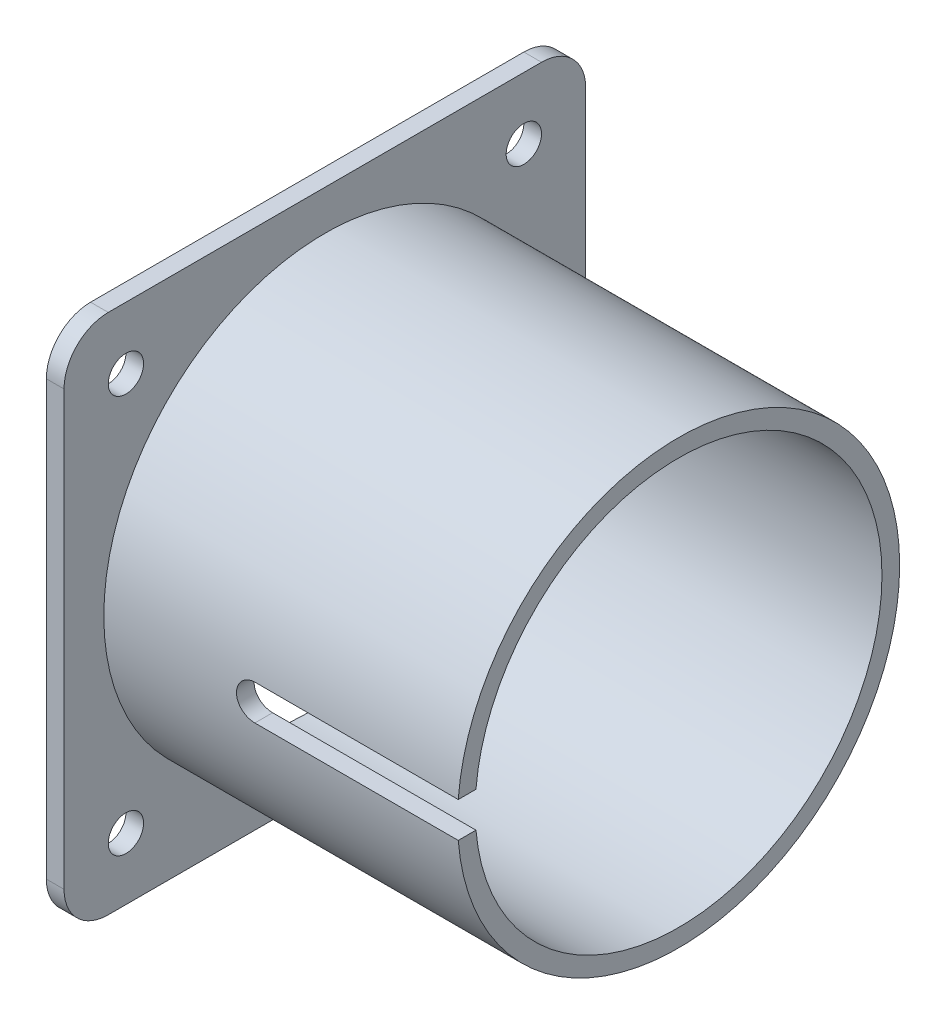
ISO-10303-21;
HEADER;
FILE_DESCRIPTION(('STEP AP214'),'2;1');
FILE_NAME('part.step','',(''),(''),'','','');
FILE_SCHEMA(('AUTOMOTIVE_DESIGN { 1 0 10303 214 1 1 1 1 }'));
ENDSEC;
DATA;
#1=APPLICATION_CONTEXT('core data for automotive mechanical design processes');
#2=APPLICATION_PROTOCOL_DEFINITION('international standard','automotive_design',2000,#1);
#3=PRODUCT_CONTEXT('',#1,'mechanical');
#4=PRODUCT('Part','Part','',(#3));
#5=PRODUCT_RELATED_PRODUCT_CATEGORY('part','',(#4));
#6=PRODUCT_DEFINITION_FORMATION('','',#4);
#7=PRODUCT_DEFINITION_CONTEXT('part definition',#1,'design');
#8=PRODUCT_DEFINITION('design','',#6,#7);
#9=PRODUCT_DEFINITION_SHAPE('','',#8);
#10=(LENGTH_UNIT() NAMED_UNIT(*) SI_UNIT(.MILLI.,.METRE.));
#11=(NAMED_UNIT(*) PLANE_ANGLE_UNIT() SI_UNIT($,.RADIAN.));
#12=(NAMED_UNIT(*) SI_UNIT($,.STERADIAN.) SOLID_ANGLE_UNIT());
#13=UNCERTAINTY_MEASURE_WITH_UNIT(LENGTH_MEASURE(1.E-05),#10,'distance_accuracy_value','');
#14=(GEOMETRIC_REPRESENTATION_CONTEXT(3) GLOBAL_UNCERTAINTY_ASSIGNED_CONTEXT((#13)) GLOBAL_UNIT_ASSIGNED_CONTEXT((#10,
#11,#12)) REPRESENTATION_CONTEXT('',''));
#15=CARTESIAN_POINT('',(0.,0.,0.));
#16=DIRECTION('',(0.,0.,1.));
#17=DIRECTION('',(1.,0.,0.));
#18=AXIS2_PLACEMENT_3D('',#15,#16,#17);
#19=CARTESIAN_POINT('',(0.,0.,0.));
#20=DIRECTION('',(1.,0.,0.));
#21=DIRECTION('',(0.,0.,-1.));
#22=AXIS2_PLACEMENT_3D('',#19,#20,#21);
#23=PLANE('',#22);
#24=CARTESIAN_POINT('',(0.,0.,0.));
#25=DIRECTION('',(1.,0.,0.));
#26=DIRECTION('',(0.,0.,-1.));
#27=AXIS2_PLACEMENT_3D('',#24,#25,#26);
#28=CIRCLE('',#27,46.);
#29=CARTESIAN_POINT('',(0.,0.,-46.));
#30=VERTEX_POINT('',#29);
#31=EDGE_CURVE('E152',#30,#30,#28,.T.);
#32=ORIENTED_EDGE('',*,*,#31,.T.);
#33=EDGE_LOOP('',(#32));
#34=FACE_BOUND('',#33,.T.);
#35=CARTESIAN_POINT('',(0.,0.,0.));
#36=DIRECTION('',(-1.,0.,0.));
#37=DIRECTION('',(0.,0.,1.));
#38=AXIS2_PLACEMENT_3D('',#35,#36,#37);
#39=CIRCLE('',#38,50.);
#40=CARTESIAN_POINT('',(0.,0.,50.));
#41=VERTEX_POINT('',#40);
#42=EDGE_CURVE('E377',#41,#41,#39,.T.);
#43=ORIENTED_EDGE('',*,*,#42,.T.);
#44=EDGE_LOOP('',(#43));
#45=FACE_BOUND('',#44,.T.);
#46=ADVANCED_FACE('F34',(#34,#45),#23,.F.);
#47=CARTESIAN_POINT('',(4.,0.,0.));
#48=DIRECTION('',(1.,0.,0.));
#49=DIRECTION('',(0.,0.,-1.));
#50=AXIS2_PLACEMENT_3D('',#47,#48,#49);
#51=PLANE('',#50);
#52=CARTESIAN_POINT('',(4.,45.,45.));
#53=DIRECTION('',(1.,0.,0.));
#54=DIRECTION('',(0.,0.,-1.));
#55=AXIS2_PLACEMENT_3D('',#52,#53,#54);
#56=CIRCLE('',#55,3.99999999999994);
#57=CARTESIAN_POINT('',(4.,45.,41.0000000000001));
#58=VERTEX_POINT('',#57);
#59=EDGE_CURVE('E139',#58,#58,#56,.T.);
#60=ORIENTED_EDGE('',*,*,#59,.F.);
#61=EDGE_LOOP('',(#60));
#62=FACE_BOUND('',#61,.T.);
#63=CARTESIAN_POINT('',(4.,-49.,49.));
#64=DIRECTION('',(1.,0.,0.));
#65=DIRECTION('',(0.,0.,-1.));
#66=AXIS2_PLACEMENT_3D('',#63,#64,#65);
#67=CIRCLE('',#66,10.);
#68=CARTESIAN_POINT('',(4.,-59.,49.));
#69=VERTEX_POINT('',#68);
#70=CARTESIAN_POINT('',(4.,-49.,59.));
#71=VERTEX_POINT('',#70);
#72=EDGE_CURVE('E311',#69,#71,#67,.F.);
#73=ORIENTED_EDGE('',*,*,#72,.F.);
#74=DIRECTION('',(0.,0.,-1.));
#75=VECTOR('',#74,1.);
#76=CARTESIAN_POINT('',(4.,-59.,0.));
#77=LINE('',#76,#75);
#78=CARTESIAN_POINT('',(4.,-59.,-49.));
#79=VERTEX_POINT('',#78);
#80=EDGE_CURVE('E312',#69,#79,#77,.T.);
#81=ORIENTED_EDGE('',*,*,#80,.T.);
#82=CARTESIAN_POINT('',(4.,-49.,-49.));
#83=DIRECTION('',(1.,0.,0.));
#84=DIRECTION('',(0.,0.,-1.));
#85=AXIS2_PLACEMENT_3D('',#82,#83,#84);
#86=CIRCLE('',#85,10.);
#87=CARTESIAN_POINT('',(4.,-49.,-59.));
#88=VERTEX_POINT('',#87);
#89=EDGE_CURVE('E315',#88,#79,#86,.F.);
#90=ORIENTED_EDGE('',*,*,#89,.F.);
#91=DIRECTION('',(0.,-1.,0.));
#92=VECTOR('',#91,1.);
#93=CARTESIAN_POINT('',(4.,0.,-59.));
#94=LINE('',#93,#92);
#95=CARTESIAN_POINT('',(4.,49.,-59.));
#96=VERTEX_POINT('',#95);
#97=EDGE_CURVE('E324',#96,#88,#94,.T.);
#98=ORIENTED_EDGE('',*,*,#97,.F.);
#99=CARTESIAN_POINT('',(4.,49.,-49.));
#100=DIRECTION('',(1.,0.,0.));
#101=DIRECTION('',(0.,0.,-1.));
#102=AXIS2_PLACEMENT_3D('',#99,#100,#101);
#103=CIRCLE('',#102,9.99999999999999);
#104=CARTESIAN_POINT('',(4.,59.,-49.));
#105=VERTEX_POINT('',#104);
#106=EDGE_CURVE('E135',#105,#96,#103,.F.);
#107=ORIENTED_EDGE('',*,*,#106,.F.);
#108=DIRECTION('',(0.,0.,-1.));
#109=VECTOR('',#108,1.);
#110=CARTESIAN_POINT('',(4.,59.,0.));
#111=LINE('',#110,#109);
#112=CARTESIAN_POINT('',(4.,59.,49.));
#113=VERTEX_POINT('',#112);
#114=EDGE_CURVE('E119',#113,#105,#111,.T.);
#115=ORIENTED_EDGE('',*,*,#114,.F.);
#116=CARTESIAN_POINT('',(4.,49.,49.));
#117=DIRECTION('',(1.,0.,0.));
#118=DIRECTION('',(0.,0.,-1.));
#119=AXIS2_PLACEMENT_3D('',#116,#117,#118);
#120=CIRCLE('',#119,10.);
#121=CARTESIAN_POINT('',(4.,49.,59.));
#122=VERTEX_POINT('',#121);
#123=EDGE_CURVE('E132',#122,#113,#120,.F.);
#124=ORIENTED_EDGE('',*,*,#123,.F.);
#125=DIRECTION('',(0.,-1.,0.));
#126=VECTOR('',#125,1.);
#127=CARTESIAN_POINT('',(4.,0.,59.));
#128=LINE('',#127,#126);
#129=EDGE_CURVE('E58',#122,#71,#128,.T.);
#130=ORIENTED_EDGE('',*,*,#129,.T.);
#131=EDGE_LOOP('',(#73,#81,#90,#98,#107,#115,#124,#130));
#132=FACE_BOUND('',#131,.T.);
#133=CARTESIAN_POINT('',(4.,-45.,45.));
#134=DIRECTION('',(1.,0.,0.));
#135=DIRECTION('',(0.,0.,-1.));
#136=AXIS2_PLACEMENT_3D('',#133,#134,#135);
#137=CIRCLE('',#136,4.);
#138=CARTESIAN_POINT('',(4.,-45.,41.));
#139=VERTEX_POINT('',#138);
#140=EDGE_CURVE('E313',#139,#139,#137,.F.);
#141=ORIENTED_EDGE('',*,*,#140,.T.);
#142=EDGE_LOOP('',(#141));
#143=FACE_BOUND('',#142,.T.);
#144=CARTESIAN_POINT('',(4.,-45.,-45.));
#145=DIRECTION('',(1.,0.,0.));
#146=DIRECTION('',(0.,0.,-1.));
#147=AXIS2_PLACEMENT_3D('',#144,#145,#146);
#148=CIRCLE('',#147,4.00000000000001);
#149=CARTESIAN_POINT('',(4.,-45.,-49.));
#150=VERTEX_POINT('',#149);
#151=EDGE_CURVE('E318',#150,#150,#148,.T.);
#152=ORIENTED_EDGE('',*,*,#151,.F.);
#153=EDGE_LOOP('',(#152));
#154=FACE_BOUND('',#153,.T.);
#155=CARTESIAN_POINT('',(4.,45.,-45.));
#156=DIRECTION('',(1.,0.,0.));
#157=DIRECTION('',(0.,0.,-1.));
#158=AXIS2_PLACEMENT_3D('',#155,#156,#157);
#159=CIRCLE('',#158,4.00000000000001);
#160=CARTESIAN_POINT('',(4.,45.,-49.));
#161=VERTEX_POINT('',#160);
#162=EDGE_CURVE('E181',#161,#161,#159,.F.);
#163=ORIENTED_EDGE('',*,*,#162,.T.);
#164=EDGE_LOOP('',(#163));
#165=FACE_BOUND('',#164,.T.);
#166=CARTESIAN_POINT('',(4.,0.,0.));
#167=DIRECTION('',(1.,0.,0.));
#168=DIRECTION('',(0.,0.,-1.));
#169=AXIS2_PLACEMENT_3D('',#166,#167,#168);
#170=CIRCLE('',#169,50.);
#171=CARTESIAN_POINT('',(4.,0.,-50.));
#172=VERTEX_POINT('',#171);
#173=EDGE_CURVE('E334',#172,#172,#170,.T.);
#174=ORIENTED_EDGE('',*,*,#173,.F.);
#175=EDGE_LOOP('',(#174));
#176=FACE_BOUND('',#175,.T.);
#177=ADVANCED_FACE('F130',(#62,#132,#143,#154,#165,#176),#51,.T.);
#178=CARTESIAN_POINT('',(4.,-49.,49.));
#179=DIRECTION('',(-1.,0.,0.));
#180=DIRECTION('',(0.,0.,1.));
#181=AXIS2_PLACEMENT_3D('',#178,#179,#180);
#182=CYLINDRICAL_SURFACE('',#181,10.);
#183=CARTESIAN_POINT('',(0.,-49.,49.));
#184=DIRECTION('',(1.,0.,0.));
#185=DIRECTION('',(0.,0.,-1.));
#186=AXIS2_PLACEMENT_3D('',#183,#184,#185);
#187=CIRCLE('',#186,10.);
#188=CARTESIAN_POINT('',(0.,-59.,49.));
#189=VERTEX_POINT('',#188);
#190=CARTESIAN_POINT('',(0.,-49.,59.));
#191=VERTEX_POINT('',#190);
#192=EDGE_CURVE('E158',#189,#191,#187,.F.);
#193=ORIENTED_EDGE('',*,*,#192,.F.);
#194=DIRECTION('',(-1.,0.,0.));
#195=VECTOR('',#194,1.);
#196=CARTESIAN_POINT('',(4.,-59.,49.));
#197=LINE('',#196,#195);
#198=EDGE_CURVE('E97',#69,#189,#197,.T.);
#199=ORIENTED_EDGE('',*,*,#198,.F.);
#200=ORIENTED_EDGE('',*,*,#72,.T.);
#201=DIRECTION('',(-1.,0.,0.));
#202=VECTOR('',#201,1.);
#203=CARTESIAN_POINT('',(4.,-49.,59.));
#204=LINE('',#203,#202);
#205=EDGE_CURVE('E92',#71,#191,#204,.T.);
#206=ORIENTED_EDGE('',*,*,#205,.T.);
#207=EDGE_LOOP('',(#193,#199,#200,#206));
#208=FACE_BOUND('',#207,.T.);
#209=ADVANCED_FACE('F252',(#208),#182,.T.);
#210=CARTESIAN_POINT('',(4.,-59.,0.));
#211=DIRECTION('',(0.,1.,0.));
#212=DIRECTION('',(0.,0.,1.));
#213=AXIS2_PLACEMENT_3D('',#210,#211,#212);
#214=PLANE('',#213);
#215=DIRECTION('',(0.,0.,-1.));
#216=VECTOR('',#215,1.);
#217=CARTESIAN_POINT('',(0.,-59.,0.));
#218=LINE('',#217,#216);
#219=CARTESIAN_POINT('',(0.,-59.,-49.));
#220=VERTEX_POINT('',#219);
#221=EDGE_CURVE('E161',#189,#220,#218,.T.);
#222=ORIENTED_EDGE('',*,*,#221,.T.);
#223=DIRECTION('',(-1.,0.,0.));
#224=VECTOR('',#223,1.);
#225=CARTESIAN_POINT('',(4.,-59.,-49.));
#226=LINE('',#225,#224);
#227=EDGE_CURVE('E189',#79,#220,#226,.T.);
#228=ORIENTED_EDGE('',*,*,#227,.F.);
#229=ORIENTED_EDGE('',*,*,#80,.F.);
#230=ORIENTED_EDGE('',*,*,#198,.T.);
#231=EDGE_LOOP('',(#222,#228,#229,#230));
#232=FACE_BOUND('',#231,.T.);
#233=ADVANCED_FACE('F281',(#232),#214,.F.);
#234=CARTESIAN_POINT('',(4.,-49.,-49.));
#235=DIRECTION('',(-1.,0.,0.));
#236=DIRECTION('',(0.,0.,1.));
#237=AXIS2_PLACEMENT_3D('',#234,#235,#236);
#238=CYLINDRICAL_SURFACE('',#237,10.);
#239=CARTESIAN_POINT('',(0.,-49.,-49.));
#240=DIRECTION('',(1.,0.,0.));
#241=DIRECTION('',(0.,0.,-1.));
#242=AXIS2_PLACEMENT_3D('',#239,#240,#241);
#243=CIRCLE('',#242,10.);
#244=CARTESIAN_POINT('',(0.,-49.,-59.));
#245=VERTEX_POINT('',#244);
#246=EDGE_CURVE('E164',#245,#220,#243,.F.);
#247=ORIENTED_EDGE('',*,*,#246,.F.);
#248=DIRECTION('',(-1.,0.,0.));
#249=VECTOR('',#248,1.);
#250=CARTESIAN_POINT('',(4.,-49.,-59.));
#251=LINE('',#250,#249);
#252=EDGE_CURVE('E187',#88,#245,#251,.T.);
#253=ORIENTED_EDGE('',*,*,#252,.F.);
#254=ORIENTED_EDGE('',*,*,#89,.T.);
#255=ORIENTED_EDGE('',*,*,#227,.T.);
#256=EDGE_LOOP('',(#247,#253,#254,#255));
#257=FACE_BOUND('',#256,.T.);
#258=ADVANCED_FACE('F285',(#257),#238,.T.);
#259=CARTESIAN_POINT('',(4.,0.,-59.));
#260=DIRECTION('',(0.,0.,-1.));
#261=DIRECTION('',(0.,1.,0.));
#262=AXIS2_PLACEMENT_3D('',#259,#260,#261);
#263=PLANE('',#262);
#264=DIRECTION('',(0.,-1.,0.));
#265=VECTOR('',#264,1.);
#266=CARTESIAN_POINT('',(0.,0.,-59.));
#267=LINE('',#266,#265);
#268=CARTESIAN_POINT('',(0.,49.,-59.));
#269=VERTEX_POINT('',#268);
#270=EDGE_CURVE('E167',#269,#245,#267,.T.);
#271=ORIENTED_EDGE('',*,*,#270,.F.);
#272=DIRECTION('',(-1.,0.,0.));
#273=VECTOR('',#272,1.);
#274=CARTESIAN_POINT('',(4.,49.,-59.));
#275=LINE('',#274,#273);
#276=EDGE_CURVE('E185',#96,#269,#275,.T.);
#277=ORIENTED_EDGE('',*,*,#276,.F.);
#278=ORIENTED_EDGE('',*,*,#97,.T.);
#279=ORIENTED_EDGE('',*,*,#252,.T.);
#280=EDGE_LOOP('',(#271,#277,#278,#279));
#281=FACE_BOUND('',#280,.T.);
#282=ADVANCED_FACE('F291',(#281),#263,.T.);
#283=CARTESIAN_POINT('',(4.,49.,-49.));
#284=DIRECTION('',(-1.,0.,0.));
#285=DIRECTION('',(0.,0.,1.));
#286=AXIS2_PLACEMENT_3D('',#283,#284,#285);
#287=CYLINDRICAL_SURFACE('',#286,9.99999999999999);
#288=CARTESIAN_POINT('',(0.,49.,-49.));
#289=DIRECTION('',(1.,0.,0.));
#290=DIRECTION('',(0.,0.,-1.));
#291=AXIS2_PLACEMENT_3D('',#288,#289,#290);
#292=CIRCLE('',#291,9.99999999999999);
#293=CARTESIAN_POINT('',(0.,59.,-49.));
#294=VERTEX_POINT('',#293);
#295=EDGE_CURVE('E170',#294,#269,#292,.F.);
#296=ORIENTED_EDGE('',*,*,#295,.F.);
#297=DIRECTION('',(-1.,0.,0.));
#298=VECTOR('',#297,1.);
#299=CARTESIAN_POINT('',(4.,59.,-49.));
#300=LINE('',#299,#298);
#301=EDGE_CURVE('E126',#105,#294,#300,.T.);
#302=ORIENTED_EDGE('',*,*,#301,.F.);
#303=ORIENTED_EDGE('',*,*,#106,.T.);
#304=ORIENTED_EDGE('',*,*,#276,.T.);
#305=EDGE_LOOP('',(#296,#302,#303,#304));
#306=FACE_BOUND('',#305,.T.);
#307=ADVANCED_FACE('F295',(#306),#287,.T.);
#308=CARTESIAN_POINT('',(4.,59.,0.));
#309=DIRECTION('',(0.,1.,0.));
#310=DIRECTION('',(0.,0.,1.));
#311=AXIS2_PLACEMENT_3D('',#308,#309,#310);
#312=PLANE('',#311);
#313=DIRECTION('',(0.,0.,-1.));
#314=VECTOR('',#313,1.);
#315=CARTESIAN_POINT('',(0.,59.,0.));
#316=LINE('',#315,#314);
#317=CARTESIAN_POINT('',(0.,59.,49.));
#318=VERTEX_POINT('',#317);
#319=EDGE_CURVE('E121',#318,#294,#316,.T.);
#320=ORIENTED_EDGE('',*,*,#319,.F.);
#321=DIRECTION('',(-1.,0.,0.));
#322=VECTOR('',#321,1.);
#323=CARTESIAN_POINT('',(4.,59.,49.));
#324=LINE('',#323,#322);
#325=EDGE_CURVE('E116',#113,#318,#324,.T.);
#326=ORIENTED_EDGE('',*,*,#325,.F.);
#327=ORIENTED_EDGE('',*,*,#114,.T.);
#328=ORIENTED_EDGE('',*,*,#301,.T.);
#329=EDGE_LOOP('',(#320,#326,#327,#328));
#330=FACE_BOUND('',#329,.T.);
#331=ADVANCED_FACE('F118',(#330),#312,.T.);
#332=CARTESIAN_POINT('',(4.,49.,49.));
#333=DIRECTION('',(-1.,0.,0.));
#334=DIRECTION('',(0.,0.,1.));
#335=AXIS2_PLACEMENT_3D('',#332,#333,#334);
#336=CYLINDRICAL_SURFACE('',#335,10.);
#337=CARTESIAN_POINT('',(0.,49.,49.));
#338=DIRECTION('',(1.,0.,0.));
#339=DIRECTION('',(0.,0.,-1.));
#340=AXIS2_PLACEMENT_3D('',#337,#338,#339);
#341=CIRCLE('',#340,10.);
#342=CARTESIAN_POINT('',(0.,49.,59.));
#343=VERTEX_POINT('',#342);
#344=EDGE_CURVE('E174',#343,#318,#341,.F.);
#345=ORIENTED_EDGE('',*,*,#344,.F.);
#346=DIRECTION('',(-1.,0.,0.));
#347=VECTOR('',#346,1.);
#348=CARTESIAN_POINT('',(4.,49.,59.));
#349=LINE('',#348,#347);
#350=EDGE_CURVE('E127',#122,#343,#349,.T.);
#351=ORIENTED_EDGE('',*,*,#350,.F.);
#352=ORIENTED_EDGE('',*,*,#123,.T.);
#353=ORIENTED_EDGE('',*,*,#325,.T.);
#354=EDGE_LOOP('',(#345,#351,#352,#353));
#355=FACE_BOUND('',#354,.T.);
#356=ADVANCED_FACE('F137',(#355),#336,.T.);
#357=CARTESIAN_POINT('',(4.,0.,59.));
#358=DIRECTION('',(0.,0.,-1.));
#359=DIRECTION('',(0.,1.,0.));
#360=AXIS2_PLACEMENT_3D('',#357,#358,#359);
#361=PLANE('',#360);
#362=DIRECTION('',(0.,-1.,0.));
#363=VECTOR('',#362,1.);
#364=CARTESIAN_POINT('',(0.,0.,59.));
#365=LINE('',#364,#363);
#366=EDGE_CURVE('E176',#343,#191,#365,.T.);
#367=ORIENTED_EDGE('',*,*,#366,.T.);
#368=ORIENTED_EDGE('',*,*,#205,.F.);
#369=ORIENTED_EDGE('',*,*,#129,.F.);
#370=ORIENTED_EDGE('',*,*,#350,.T.);
#371=EDGE_LOOP('',(#367,#368,#369,#370));
#372=FACE_BOUND('',#371,.T.);
#373=ADVANCED_FACE('F304',(#372),#361,.F.);
#374=CARTESIAN_POINT('',(4.,-45.,45.));
#375=DIRECTION('',(-1.,0.,0.));
#376=DIRECTION('',(0.,0.,1.));
#377=AXIS2_PLACEMENT_3D('',#374,#375,#376);
#378=CYLINDRICAL_SURFACE('',#377,4.);
#379=ORIENTED_EDGE('',*,*,#140,.F.);
#380=EDGE_LOOP('',(#379));
#381=FACE_BOUND('',#380,.T.);
#382=CARTESIAN_POINT('',(0.,-45.,45.));
#383=DIRECTION('',(1.,0.,0.));
#384=DIRECTION('',(0.,0.,-1.));
#385=AXIS2_PLACEMENT_3D('',#382,#383,#384);
#386=CIRCLE('',#385,4.);
#387=CARTESIAN_POINT('',(0.,-45.,41.));
#388=VERTEX_POINT('',#387);
#389=EDGE_CURVE('E155',#388,#388,#386,.F.);
#390=ORIENTED_EDGE('',*,*,#389,.T.);
#391=EDGE_LOOP('',(#390));
#392=FACE_BOUND('',#391,.T.);
#393=ADVANCED_FACE('F233',(#381,#392),#378,.F.);
#394=CARTESIAN_POINT('',(4.,0.,0.));
#395=DIRECTION('',(-1.,0.,0.));
#396=DIRECTION('',(0.,0.,1.));
#397=AXIS2_PLACEMENT_3D('',#394,#395,#396);
#398=CYLINDRICAL_SURFACE('',#397,46.);
#399=DIRECTION('',(-1.,0.,0.));
#400=VECTOR('',#399,1.);
#401=CARTESIAN_POINT('',(4.,-4.00000000000001,45.8257569495584));
#402=LINE('',#401,#400);
#403=CARTESIAN_POINT('',(84.,-4.,45.8257569495584));
#404=VERTEX_POINT('',#403);
#405=CARTESIAN_POINT('',(38.,-4.00000000000001,45.8257569495584));
#406=VERTEX_POINT('',#405);
#407=EDGE_CURVE('E224',#404,#406,#402,.T.);
#408=ORIENTED_EDGE('',*,*,#407,.F.);
#409=CARTESIAN_POINT('',(84.,0.,0.));
#410=DIRECTION('',(1.,0.,0.));
#411=DIRECTION('',(0.,0.,-1.));
#412=AXIS2_PLACEMENT_3D('',#409,#410,#411);
#413=CIRCLE('',#412,46.);
#414=CARTESIAN_POINT('',(84.,4.,45.8257569495584));
#415=VERTEX_POINT('',#414);
#416=EDGE_CURVE('E337',#404,#415,#413,.T.);
#417=ORIENTED_EDGE('',*,*,#416,.T.);
#418=DIRECTION('',(-1.,0.,0.));
#419=VECTOR('',#418,1.);
#420=CARTESIAN_POINT('',(4.,3.99999999999999,45.8257569495584));
#421=LINE('',#420,#419);
#422=CARTESIAN_POINT('',(38.,3.99999999999999,45.8257569495584));
#423=VERTEX_POINT('',#422);
#424=EDGE_CURVE('E225',#423,#415,#421,.F.);
#425=ORIENTED_EDGE('',*,*,#424,.F.);
#426=CARTESIAN_POINT('',(38.,-4.00000000000001,45.8257569495584));
#427=CARTESIAN_POINT('',(37.8877224513733,-4.00001102550282,45.8257529044037));
#428=CARTESIAN_POINT('',(37.7754503031204,-3.995272714164,45.8261695007407));
#429=CARTESIAN_POINT('',(37.5517134245547,-3.97638278224497,45.8278140933559));
#430=CARTESIAN_POINT('',(37.4402486446931,-3.96223174436381,45.8290420394071));
#431=CARTESIAN_POINT('',(37.2190039723058,-3.92461784622258,45.8322780665495));
#432=CARTESIAN_POINT('',(37.1092227162988,-3.90116298532559,45.8342854774309));
#433=CARTESIAN_POINT('',(36.8920608047351,-3.84513499734859,45.8390196204446));
#434=CARTESIAN_POINT('',(36.7846801271712,-3.81256195389575,45.8417463459796));
#435=CARTESIAN_POINT('',(36.4671905409549,-3.70144090958984,45.8508991135314));
#436=CARTESIAN_POINT('',(36.2616251744573,-3.60947237250249,45.8582994506513));
#437=CARTESIAN_POINT('',(35.868991474459,-3.39251823460425,45.874857736709));
#438=CARTESIAN_POINT('',(35.6819205755444,-3.26753722189252,45.8840154413582));
#439=CARTESIAN_POINT('',(35.330906030811,-2.98770871022453,45.9030854943989));
#440=CARTESIAN_POINT('',(35.1670184742557,-2.8327908531138,45.9129995865775));
#441=CARTESIAN_POINT('',(34.8675255642532,-2.49762518846603,45.9324502996737));
#442=CARTESIAN_POINT('',(34.7319245171118,-2.31737353112131,45.9419868629379));
#443=CARTESIAN_POINT('',(34.4926733572193,-1.93632205506173,45.959623970469));
#444=CARTESIAN_POINT('',(34.3890731985934,-1.73549075528961,45.9677222612685));
#445=CARTESIAN_POINT('',(34.2170928533418,-1.31921373923267,45.9815506041187));
#446=CARTESIAN_POINT('',(34.1487098662733,-1.10376918652503,45.9872808444679));
#447=CARTESIAN_POINT('',(34.0492622677556,-0.664948288229322,45.9957156218925));
#448=CARTESIAN_POINT('',(34.0181036650158,-0.441593392413733,45.9984277784137));
#449=CARTESIAN_POINT('',(33.9936988174627,0.00719677519383702,46.0005466701046));
#450=CARTESIAN_POINT('',(34.000452741019,0.232632056220367,45.9999533905949));
#451=CARTESIAN_POINT('',(34.0516055699711,0.678533827579892,45.9955344172541));
#452=CARTESIAN_POINT('',(34.095902306148,0.899012137829142,45.9917174963571));
#453=CARTESIAN_POINT('',(34.2207249561796,1.32939163482898,45.9812905909696));
#454=CARTESIAN_POINT('',(34.3012510661322,1.53929276432188,45.9746805913611));
#455=CARTESIAN_POINT('',(34.4963593186919,1.94288815251343,45.9593958779641));
#456=CARTESIAN_POINT('',(34.6109877968295,2.1365598981945,45.950718358212));
#457=CARTESIAN_POINT('',(34.8710176161641,2.50194703445642,45.9322738300639));
#458=CARTESIAN_POINT('',(35.0164182336236,2.67366294126964,45.9225068472938));
#459=CARTESIAN_POINT('',(35.3343813980192,2.99083490969617,45.9029442254327));
#460=CARTESIAN_POINT('',(35.5070288199423,3.13620575939861,45.8931485939446));
#461=CARTESIAN_POINT('',(35.8744961648295,3.39599819421689,45.8746579155242));
#462=CARTESIAN_POINT('',(36.0693228774057,3.51041026571793,45.8659632073408));
#463=CARTESIAN_POINT('',(36.3738087059696,3.65626169165439,45.8544883798484));
#464=CARTESIAN_POINT('',(36.4774446933759,3.70061293690484,45.8509221173338));
#465=CARTESIAN_POINT('',(36.6880944213187,3.78041850982502,45.8444112889442));
#466=CARTESIAN_POINT('',(36.795106866775,3.81587620312096,45.8414664879539));
#467=CARTESIAN_POINT('',(37.0116301905509,3.87760140205966,45.8362865513809));
#468=CARTESIAN_POINT('',(37.1211382251568,3.90387886046065,45.8340506474916));
#469=CARTESIAN_POINT('',(37.3419506407272,3.94710223581782,45.8303486350327));
#470=CARTESIAN_POINT('',(37.4532541182751,3.96405270383299,45.8288821510447));
#471=CARTESIAN_POINT('',(37.6373248382454,3.98418809919593,45.8271350472007));
#472=CARTESIAN_POINT('',(37.7098007402086,3.99012120541037,45.826618460365));
#473=CARTESIAN_POINT('',(37.8548485892734,3.99802437438724,45.8259294054503));
#474=CARTESIAN_POINT('',(37.9274201742778,4.00000103391263,45.8257563645655));
#475=CARTESIAN_POINT('',(38.,3.99999999999999,45.8257569495584));
#476=B_SPLINE_CURVE_WITH_KNOTS('',3,(#426,#427,#428,#429,#430,#431,#432,#433,#434,#435,#436,
#437,#438,#439,#440,#441,#442,#443,#444,#445,#446,#447,#448,#449,#450,#451,#452,#453,#454,#455,
#456,#457,#458,#459,#460,#461,#462,#463,#464,#465,#466,#467,#468,#469,#470,#471,#472,#473,#474,
#475),.UNSPECIFIED.,.F.,.F.,(4,2,2,2,2,2,2,2,2,2,2,2,2,2,2,2,2,2,2,2,2,2,2,2,4),(0.,
0.336722256332244,0.673423669662345,1.00983621474631,1.34624567453238,2.01873727446539,
2.69113546013297,3.36513358272302,4.0392342392523,4.71438192570189,5.38947591662488,
6.06286167301157,6.73625041990605,7.40781246556925,8.07937814622414,8.75186049585917,
9.42432703097572,10.0989312510334,10.7737425417571,11.1117630235776,11.4496553931529,
11.7871802913019,12.1245403494637,12.342600236068,12.5602962376538),.UNSPECIFIED.);
#477=EDGE_CURVE('E215',#406,#423,#476,.T.);
#478=ORIENTED_EDGE('',*,*,#477,.F.);
#479=EDGE_LOOP('',(#408,#417,#425,#478));
#480=FACE_BOUND('',#479,.T.);
#481=ORIENTED_EDGE('',*,*,#31,.F.);
#482=EDGE_LOOP('',(#481));
#483=FACE_BOUND('',#482,.T.);
#484=ADVANCED_FACE('F228',(#480,#483),#398,.F.);
#485=CARTESIAN_POINT('',(4.,-45.,-45.));
#486=DIRECTION('',(-1.,0.,0.));
#487=DIRECTION('',(0.,0.,1.));
#488=AXIS2_PLACEMENT_3D('',#485,#486,#487);
#489=CYLINDRICAL_SURFACE('',#488,4.00000000000001);
#490=ORIENTED_EDGE('',*,*,#151,.T.);
#491=EDGE_LOOP('',(#490));
#492=FACE_BOUND('',#491,.T.);
#493=CARTESIAN_POINT('',(0.,-45.,-45.));
#494=DIRECTION('',(1.,0.,0.));
#495=DIRECTION('',(0.,0.,-1.));
#496=AXIS2_PLACEMENT_3D('',#493,#494,#495);
#497=CIRCLE('',#496,4.00000000000001);
#498=CARTESIAN_POINT('',(0.,-45.,-49.));
#499=VERTEX_POINT('',#498);
#500=EDGE_CURVE('E148',#499,#499,#497,.T.);
#501=ORIENTED_EDGE('',*,*,#500,.F.);
#502=EDGE_LOOP('',(#501));
#503=FACE_BOUND('',#502,.T.);
#504=ADVANCED_FACE('F232',(#492,#503),#489,.F.);
#505=CARTESIAN_POINT('',(4.,45.,-45.));
#506=DIRECTION('',(-1.,0.,0.));
#507=DIRECTION('',(0.,0.,1.));
#508=AXIS2_PLACEMENT_3D('',#505,#506,#507);
#509=CYLINDRICAL_SURFACE('',#508,4.00000000000001);
#510=ORIENTED_EDGE('',*,*,#162,.F.);
#511=EDGE_LOOP('',(#510));
#512=FACE_BOUND('',#511,.T.);
#513=CARTESIAN_POINT('',(0.,45.,-45.));
#514=DIRECTION('',(1.,0.,0.));
#515=DIRECTION('',(0.,0.,-1.));
#516=AXIS2_PLACEMENT_3D('',#513,#514,#515);
#517=CIRCLE('',#516,4.00000000000001);
#518=CARTESIAN_POINT('',(0.,45.,-49.));
#519=VERTEX_POINT('',#518);
#520=EDGE_CURVE('E145',#519,#519,#517,.F.);
#521=ORIENTED_EDGE('',*,*,#520,.T.);
#522=EDGE_LOOP('',(#521));
#523=FACE_BOUND('',#522,.T.);
#524=ADVANCED_FACE('F36',(#512,#523),#509,.F.);
#525=CARTESIAN_POINT('',(4.,45.,45.));
#526=DIRECTION('',(-1.,0.,0.));
#527=DIRECTION('',(0.,0.,1.));
#528=AXIS2_PLACEMENT_3D('',#525,#526,#527);
#529=CYLINDRICAL_SURFACE('',#528,3.99999999999994);
#530=ORIENTED_EDGE('',*,*,#59,.T.);
#531=EDGE_LOOP('',(#530));
#532=FACE_BOUND('',#531,.T.);
#533=CARTESIAN_POINT('',(0.,45.,45.));
#534=DIRECTION('',(1.,0.,0.));
#535=DIRECTION('',(0.,0.,-1.));
#536=AXIS2_PLACEMENT_3D('',#533,#534,#535);
#537=CIRCLE('',#536,3.99999999999994);
#538=CARTESIAN_POINT('',(0.,45.,41.0000000000001));
#539=VERTEX_POINT('',#538);
#540=EDGE_CURVE('E178',#539,#539,#537,.T.);
#541=ORIENTED_EDGE('',*,*,#540,.F.);
#542=EDGE_LOOP('',(#541));
#543=FACE_BOUND('',#542,.T.);
#544=ADVANCED_FACE('F241',(#532,#543),#529,.F.);
#545=CARTESIAN_POINT('',(0.,0.,0.));
#546=DIRECTION('',(-1.,0.,0.));
#547=DIRECTION('',(0.,0.,1.));
#548=AXIS2_PLACEMENT_3D('',#545,#546,#547);
#549=CIRCLE('',#548,54.);
#550=CARTESIAN_POINT('',(0.,0.,54.));
#551=VERTEX_POINT('',#550);
#552=EDGE_CURVE('E268',#551,#551,#549,.T.);
#553=ORIENTED_EDGE('',*,*,#552,.F.);
#554=EDGE_LOOP('',(#553));
#555=FACE_BOUND('',#554,.T.);
#556=ORIENTED_EDGE('',*,*,#520,.F.);
#557=EDGE_LOOP('',(#556));
#558=FACE_BOUND('',#557,.T.);
#559=ORIENTED_EDGE('',*,*,#500,.T.);
#560=EDGE_LOOP('',(#559));
#561=FACE_BOUND('',#560,.T.);
#562=ORIENTED_EDGE('',*,*,#389,.F.);
#563=EDGE_LOOP('',(#562));
#564=FACE_BOUND('',#563,.T.);
#565=ORIENTED_EDGE('',*,*,#192,.T.);
#566=ORIENTED_EDGE('',*,*,#366,.F.);
#567=ORIENTED_EDGE('',*,*,#344,.T.);
#568=ORIENTED_EDGE('',*,*,#319,.T.);
#569=ORIENTED_EDGE('',*,*,#295,.T.);
#570=ORIENTED_EDGE('',*,*,#270,.T.);
#571=ORIENTED_EDGE('',*,*,#246,.T.);
#572=ORIENTED_EDGE('',*,*,#221,.F.);
#573=EDGE_LOOP('',(#565,#566,#567,#568,#569,#570,#571,#572));
#574=FACE_BOUND('',#573,.T.);
#575=ORIENTED_EDGE('',*,*,#540,.T.);
#576=EDGE_LOOP('',(#575));
#577=FACE_BOUND('',#576,.T.);
#578=ADVANCED_FACE('F248',(#555,#558,#561,#564,#574,#577),#23,.F.);
#579=CARTESIAN_POINT('',(84.,0.,0.));
#580=DIRECTION('',(1.,0.,0.));
#581=DIRECTION('',(0.,0.,-1.));
#582=AXIS2_PLACEMENT_3D('',#579,#580,#581);
#583=PLANE('',#582);
#584=DIRECTION('',(0.,0.,1.));
#585=VECTOR('',#584,1.);
#586=CARTESIAN_POINT('',(84.,-4.,40.));
#587=LINE('',#586,#585);
#588=CARTESIAN_POINT('',(84.,-4.,49.8397431775085));
#589=VERTEX_POINT('',#588);
#590=EDGE_CURVE('E354',#404,#589,#587,.T.);
#591=ORIENTED_EDGE('',*,*,#590,.T.);
#592=CARTESIAN_POINT('',(84.,0.,0.));
#593=DIRECTION('',(1.,0.,0.));
#594=DIRECTION('',(0.,0.,-1.));
#595=AXIS2_PLACEMENT_3D('',#592,#593,#594);
#596=CIRCLE('',#595,50.);
#597=CARTESIAN_POINT('',(84.,4.,49.8397431775085));
#598=VERTEX_POINT('',#597);
#599=EDGE_CURVE('E149',#589,#598,#596,.T.);
#600=ORIENTED_EDGE('',*,*,#599,.T.);
#601=DIRECTION('',(0.,0.,1.));
#602=VECTOR('',#601,1.);
#603=CARTESIAN_POINT('',(84.,4.,40.));
#604=LINE('',#603,#602);
#605=EDGE_CURVE('E49',#415,#598,#604,.T.);
#606=ORIENTED_EDGE('',*,*,#605,.F.);
#607=ORIENTED_EDGE('',*,*,#416,.F.);
#608=EDGE_LOOP('',(#591,#600,#606,#607));
#609=FACE_BOUND('',#608,.T.);
#610=ADVANCED_FACE('F257',(#609),#583,.T.);
#611=CARTESIAN_POINT('',(84.,0.,0.));
#612=DIRECTION('',(-1.,0.,0.));
#613=DIRECTION('',(0.,0.,1.));
#614=AXIS2_PLACEMENT_3D('',#611,#612,#613);
#615=CYLINDRICAL_SURFACE('',#614,50.);
#616=ORIENTED_EDGE('',*,*,#599,.F.);
#617=DIRECTION('',(-1.,0.,0.));
#618=VECTOR('',#617,1.);
#619=CARTESIAN_POINT('',(84.,-4.,49.8397431775085));
#620=LINE('',#619,#618);
#621=CARTESIAN_POINT('',(38.,-4.00000000000001,49.8397431775085));
#622=VERTEX_POINT('',#621);
#623=EDGE_CURVE('E11',#589,#622,#620,.T.);
#624=ORIENTED_EDGE('',*,*,#623,.T.);
#625=CARTESIAN_POINT('',(38.,-4.00000000000001,49.8397431775085));
#626=CARTESIAN_POINT('',(37.8876877125268,-4.00001098745313,49.8397394607161));
#627=CARTESIAN_POINT('',(37.7753807809582,-3.99526978551168,49.8401227376822));
#628=CARTESIAN_POINT('',(37.5515739398711,-3.97636806720468,49.8416358240802));
#629=CARTESIAN_POINT('',(37.4400739825442,-3.96220811353822,49.8427655889149));
#630=CARTESIAN_POINT('',(37.2187561337123,-3.92456964116308,49.8457429598554));
#631=CARTESIAN_POINT('',(37.1089369167491,-3.90109890504675,49.8475899664141));
#632=CARTESIAN_POINT('',(36.8916993820081,-3.84503205110216,49.8519459162303));
#633=CARTESIAN_POINT('',(36.7842810411161,-3.81243602116736,49.8544548531121));
#634=CARTESIAN_POINT('',(36.4666774350149,-3.70123384060329,49.8628768225173));
#635=CARTESIAN_POINT('',(36.261036986503,-3.60919536638415,49.8696865479415));
#636=CARTESIAN_POINT('',(35.8682684613599,-3.39207049505588,49.8849237533469));
#637=CARTESIAN_POINT('',(35.681137654721,-3.26698898152104,49.893350994218));
#638=CARTESIAN_POINT('',(35.3300936123378,-2.98698468349433,49.910896476846));
#639=CARTESIAN_POINT('',(35.1662279669013,-2.83200221904845,49.9200160780442));
#640=CARTESIAN_POINT('',(34.8667948779754,-2.49671091219049,49.9379070745496));
#641=CARTESIAN_POINT('',(34.7312317433797,-2.31639822037802,49.946678416672));
#642=CARTESIAN_POINT('',(34.4921034420463,-1.9352854535534,49.9628966292349));
#643=CARTESIAN_POINT('',(34.3885803022064,-1.73445892564995,49.970341754691));
#644=CARTESIAN_POINT('',(34.2167481731968,-1.318217448233,49.9830532200584));
#645=CARTESIAN_POINT('',(34.1484364684816,-1.10280362515812,49.9883197279808));
#646=CARTESIAN_POINT('',(34.0490975300482,-0.663980042953247,49.9960714328366));
#647=CARTESIAN_POINT('',(34.0179908063774,-0.44058838501664,49.9985625587029));
#648=CARTESIAN_POINT('',(33.9936992676467,0.00826382344173987,50.0005029142983));
#649=CARTESIAN_POINT('',(34.0005147285947,0.233724389009654,49.9999521218876));
#650=CARTESIAN_POINT('',(34.0518100819133,0.679763071378379,49.9958754952928));
#651=CARTESIAN_POINT('',(34.096203389357,0.900351217032642,49.9923565003531));
#652=CARTESIAN_POINT('',(34.2212602369167,1.33093425694296,49.9827472262198));
#653=CARTESIAN_POINT('',(34.3019239277168,1.54092910718546,49.9766569363437));
#654=CARTESIAN_POINT('',(34.497327791411,1.94464462955437,49.9625784814431));
#655=CARTESIAN_POINT('',(34.612107519307,2.13834607437851,49.9545881155842));
#656=CARTESIAN_POINT('',(34.8724608363047,2.5037601811807,49.9376080237909));
#657=CARTESIAN_POINT('',(35.0180335799067,2.67547344669172,49.9286183252987));
#658=CARTESIAN_POINT('',(35.3362696164171,2.99251633158349,49.9106219179841));
#659=CARTESIAN_POINT('',(35.5090042064251,3.13777427927926,49.9016152278343));
#660=CARTESIAN_POINT('',(35.8766191585568,3.39732543135982,49.8846186515108));
#661=CARTESIAN_POINT('',(36.0715063371623,3.51160906795729,49.8766290799224));
#662=CARTESIAN_POINT('',(36.3760545175342,3.65725936060354,49.8660886673361));
#663=CARTESIAN_POINT('',(36.4797049954741,3.7015416341012,49.8628135728839));
#664=CARTESIAN_POINT('',(36.6903748220573,3.78120864758878,49.8568356855109));
#665=CARTESIAN_POINT('',(36.797392880539,3.81659674945219,49.8541326764109));
#666=CARTESIAN_POINT('',(37.0139184405952,3.8781834205136,49.8493795893998));
#667=CARTESIAN_POINT('',(37.1234231025158,3.90439196095376,49.8473288032397));
#668=CARTESIAN_POINT('',(37.3442207588879,3.94747945118937,49.8439351837682));
#669=CARTESIAN_POINT('',(37.4555128529291,3.96436295556643,49.8425920048585));
#670=CARTESIAN_POINT('',(37.6391990063592,3.98435141307981,49.8409972193587));
#671=CARTESIAN_POINT('',(37.7113017732466,3.99022326035158,49.8405271284761));
#672=CARTESIAN_POINT('',(37.8556005265263,3.99804478676393,49.8399001062826));
#673=CARTESIAN_POINT('',(37.9277961572731,4.00000098647434,49.8397426543502));
#674=CARTESIAN_POINT('',(38.,3.99999999999999,49.8397431775085));
#675=B_SPLINE_CURVE_WITH_KNOTS('',3,(#625,#626,#627,#628,#629,#630,#631,#632,#633,#634,#635,
#636,#637,#638,#639,#640,#641,#642,#643,#644,#645,#646,#647,#648,#649,#650,#651,#652,#653,#654,
#655,#656,#657,#658,#659,#660,#661,#662,#663,#664,#665,#666,#667,#668,#669,#670,#671,#672,#673,
#674),.UNSPECIFIED.,.F.,.F.,(4,2,2,2,2,2,2,2,2,2,2,2,2,2,2,2,2,2,2,2,2,2,2,2,4),(0.,
0.336826569988946,0.673633018948503,1.01015853311159,1.34668080602307,2.01940496211965,
2.69202974896193,3.36601119657236,4.0400951792559,4.71505964752088,5.38997205397814,
6.0634398920056,6.73691263171873,7.40883780124814,8.0807657622958,8.75347583297038,
9.42616743509561,10.1006552032168,10.7753510799077,11.1133040556234,11.451129097035,
11.7885860316354,12.1258779977149,12.3428081000226,12.5593766558492),.UNSPECIFIED.);
#676=CARTESIAN_POINT('',(38.,3.99999999999999,49.8397431775085));
#677=VERTEX_POINT('',#676);
#678=EDGE_CURVE('E192',#622,#677,#675,.T.);
#679=ORIENTED_EDGE('',*,*,#678,.T.);
#680=DIRECTION('',(-1.,0.,0.));
#681=VECTOR('',#680,1.);
#682=CARTESIAN_POINT('',(84.,4.,49.8397431775085));
#683=LINE('',#682,#681);
#684=EDGE_CURVE('E42',#677,#598,#683,.F.);
#685=ORIENTED_EDGE('',*,*,#684,.T.);
#686=EDGE_LOOP('',(#616,#624,#679,#685));
#687=FACE_BOUND('',#686,.T.);
#688=ORIENTED_EDGE('',*,*,#173,.T.);
#689=EDGE_LOOP('',(#688));
#690=FACE_BOUND('',#689,.T.);
#691=ADVANCED_FACE('F200',(#687,#690),#615,.T.);
#692=CARTESIAN_POINT('',(84.,-4.,40.));
#693=DIRECTION('',(0.,-1.,0.));
#694=DIRECTION('',(1.,0.,0.));
#695=AXIS2_PLACEMENT_3D('',#692,#693,#694);
#696=PLANE('',#695);
#697=ORIENTED_EDGE('',*,*,#407,.T.);
#698=DIRECTION('',(0.,0.,1.));
#699=VECTOR('',#698,1.);
#700=CARTESIAN_POINT('',(38.,-4.00000000000001,40.));
#701=LINE('',#700,#699);
#702=EDGE_CURVE('E351',#406,#622,#701,.T.);
#703=ORIENTED_EDGE('',*,*,#702,.T.);
#704=ORIENTED_EDGE('',*,*,#623,.F.);
#705=ORIENTED_EDGE('',*,*,#590,.F.);
#706=EDGE_LOOP('',(#697,#703,#704,#705));
#707=FACE_BOUND('',#706,.T.);
#708=ADVANCED_FACE('F210',(#707),#696,.F.);
#709=CARTESIAN_POINT('',(38.,0.,40.));
#710=DIRECTION('',(0.,0.,1.));
#711=DIRECTION('',(1.,0.,0.));
#712=AXIS2_PLACEMENT_3D('',#709,#710,#711);
#713=CYLINDRICAL_SURFACE('',#712,4.);
#714=ORIENTED_EDGE('',*,*,#477,.T.);
#715=DIRECTION('',(0.,0.,1.));
#716=VECTOR('',#715,1.);
#717=CARTESIAN_POINT('',(38.,3.99999999999999,40.));
#718=LINE('',#717,#716);
#719=EDGE_CURVE('E361',#423,#677,#718,.T.);
#720=ORIENTED_EDGE('',*,*,#719,.T.);
#721=ORIENTED_EDGE('',*,*,#678,.F.);
#722=ORIENTED_EDGE('',*,*,#702,.F.);
#723=EDGE_LOOP('',(#714,#720,#721,#722));
#724=FACE_BOUND('',#723,.T.);
#725=ADVANCED_FACE('F204',(#724),#713,.F.);
#726=CARTESIAN_POINT('',(84.,4.,40.));
#727=DIRECTION('',(0.,1.,0.));
#728=DIRECTION('',(-1.,0.,0.));
#729=AXIS2_PLACEMENT_3D('',#726,#727,#728);
#730=PLANE('',#729);
#731=ORIENTED_EDGE('',*,*,#424,.T.);
#732=ORIENTED_EDGE('',*,*,#605,.T.);
#733=ORIENTED_EDGE('',*,*,#684,.F.);
#734=ORIENTED_EDGE('',*,*,#719,.F.);
#735=EDGE_LOOP('',(#731,#732,#733,#734));
#736=FACE_BOUND('',#735,.T.);
#737=ADVANCED_FACE('F209',(#736),#730,.F.);
#738=CARTESIAN_POINT('',(3.,0.,0.));
#739=DIRECTION('',(-1.,0.,0.));
#740=DIRECTION('',(0.,0.,1.));
#741=AXIS2_PLACEMENT_3D('',#738,#739,#740);
#742=CYLINDRICAL_SURFACE('',#741,54.);
#743=CARTESIAN_POINT('',(3.,0.,0.));
#744=DIRECTION('',(-1.,0.,0.));
#745=DIRECTION('',(0.,0.,1.));
#746=AXIS2_PLACEMENT_3D('',#743,#744,#745);
#747=CIRCLE('',#746,54.);
#748=CARTESIAN_POINT('',(3.,0.,54.));
#749=VERTEX_POINT('',#748);
#750=EDGE_CURVE('E371',#749,#749,#747,.T.);
#751=ORIENTED_EDGE('',*,*,#750,.F.);
#752=EDGE_LOOP('',(#751));
#753=FACE_BOUND('',#752,.T.);
#754=ORIENTED_EDGE('',*,*,#552,.T.);
#755=EDGE_LOOP('',(#754));
#756=FACE_BOUND('',#755,.T.);
#757=ADVANCED_FACE('F388',(#753,#756),#742,.F.);
#758=CARTESIAN_POINT('',(3.,0.,0.));
#759=DIRECTION('',(-1.,0.,0.));
#760=DIRECTION('',(0.,0.,1.));
#761=AXIS2_PLACEMENT_3D('',#758,#759,#760);
#762=PLANE('',#761);
#763=CARTESIAN_POINT('',(3.,0.,0.));
#764=DIRECTION('',(-1.,0.,0.));
#765=DIRECTION('',(0.,0.,1.));
#766=AXIS2_PLACEMENT_3D('',#763,#764,#765);
#767=CIRCLE('',#766,50.);
#768=CARTESIAN_POINT('',(3.,0.,50.));
#769=VERTEX_POINT('',#768);
#770=EDGE_CURVE('E375',#769,#769,#767,.T.);
#771=ORIENTED_EDGE('',*,*,#770,.F.);
#772=EDGE_LOOP('',(#771));
#773=FACE_BOUND('',#772,.T.);
#774=ORIENTED_EDGE('',*,*,#750,.T.);
#775=EDGE_LOOP('',(#774));
#776=FACE_BOUND('',#775,.T.);
#777=ADVANCED_FACE('F386',(#773,#776),#762,.T.);
#778=CARTESIAN_POINT('',(3.,0.,0.));
#779=DIRECTION('',(-1.,0.,0.));
#780=DIRECTION('',(0.,0.,1.));
#781=AXIS2_PLACEMENT_3D('',#778,#779,#780);
#782=CYLINDRICAL_SURFACE('',#781,50.);
#783=ORIENTED_EDGE('',*,*,#770,.T.);
#784=EDGE_LOOP('',(#783));
#785=FACE_BOUND('',#784,.T.);
#786=ORIENTED_EDGE('',*,*,#42,.F.);
#787=EDGE_LOOP('',(#786));
#788=FACE_BOUND('',#787,.T.);
#789=ADVANCED_FACE('F383',(#785,#788),#782,.T.);
#790=CLOSED_SHELL('',(#46,#177,#209,#233,#258,#282,#307,#331,#356,#373,#393,#484,#504,#524,#544,
#578,#610,#691,#708,#725,#737,#757,#777,#789));
#791=MANIFOLD_SOLID_BREP('B2',#790);
#792=ADVANCED_BREP_SHAPE_REPRESENTATION('',(#18,#791),#14);
#793=SHAPE_DEFINITION_REPRESENTATION(#9,#792);
ENDSEC;
END-ISO-10303-21;
